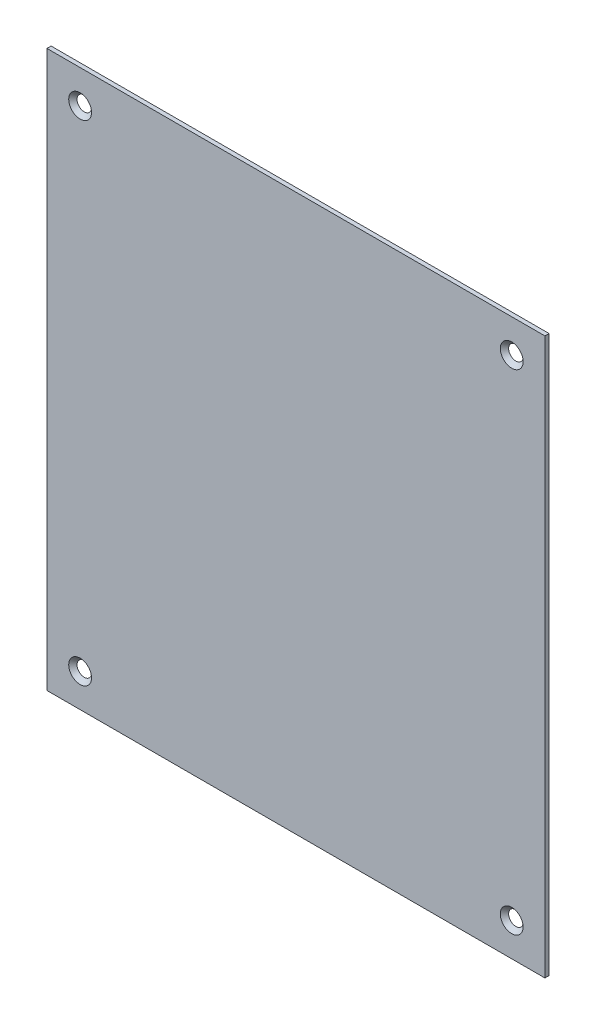
ISO-10303-21;
HEADER;
FILE_DESCRIPTION(('STEP AP214'),'2;1');
FILE_NAME('part.step','',(''),(''),'','','');
FILE_SCHEMA(('AUTOMOTIVE_DESIGN { 1 0 10303 214 1 1 1 1 }'));
ENDSEC;
DATA;
#1=APPLICATION_CONTEXT('core data for automotive mechanical design processes');
#2=APPLICATION_PROTOCOL_DEFINITION('international standard','automotive_design',2000,#1);
#3=PRODUCT_CONTEXT('',#1,'mechanical');
#4=PRODUCT('Part','Part','',(#3));
#5=PRODUCT_RELATED_PRODUCT_CATEGORY('part','',(#4));
#6=PRODUCT_DEFINITION_FORMATION('','',#4);
#7=PRODUCT_DEFINITION_CONTEXT('part definition',#1,'design');
#8=PRODUCT_DEFINITION('design','',#6,#7);
#9=PRODUCT_DEFINITION_SHAPE('','',#8);
#10=(LENGTH_UNIT() NAMED_UNIT(*) SI_UNIT(.MILLI.,.METRE.));
#11=(NAMED_UNIT(*) PLANE_ANGLE_UNIT() SI_UNIT($,.RADIAN.));
#12=(NAMED_UNIT(*) SI_UNIT($,.STERADIAN.) SOLID_ANGLE_UNIT());
#13=UNCERTAINTY_MEASURE_WITH_UNIT(LENGTH_MEASURE(1.E-05),#10,'distance_accuracy_value','');
#14=(GEOMETRIC_REPRESENTATION_CONTEXT(3) GLOBAL_UNCERTAINTY_ASSIGNED_CONTEXT((#13)) GLOBAL_UNIT_ASSIGNED_CONTEXT((#10,
#11,#12)) REPRESENTATION_CONTEXT('',''));
#15=CARTESIAN_POINT('',(0.,0.,0.));
#16=DIRECTION('',(0.,0.,1.));
#17=DIRECTION('',(1.,0.,0.));
#18=AXIS2_PLACEMENT_3D('',#15,#16,#17);
#19=CARTESIAN_POINT('',(0.,0.,-1.));
#20=DIRECTION('',(0.,0.,1.));
#21=DIRECTION('',(1.,0.,0.));
#22=AXIS2_PLACEMENT_3D('',#19,#20,#21);
#23=PLANE('',#22);
#24=CARTESIAN_POINT('',(-63.1340206185567,49.9896907216495,-1.));
#25=DIRECTION('',(0.,0.,1.));
#26=DIRECTION('',(1.,0.,0.));
#27=AXIS2_PLACEMENT_3D('',#24,#25,#26);
#28=CIRCLE('',#27,1.75);
#29=CARTESIAN_POINT('',(-61.3840206185567,49.9896907216495,-1.));
#30=VERTEX_POINT('',#29);
#31=EDGE_CURVE('E37',#30,#30,#28,.T.);
#32=ORIENTED_EDGE('',*,*,#31,.T.);
#33=EDGE_LOOP('',(#32));
#34=FACE_BOUND('',#33,.T.);
#35=CARTESIAN_POINT('',(-63.1340206185567,-68.0103092783505,-1.));
#36=DIRECTION('',(0.,0.,1.));
#37=DIRECTION('',(1.,0.,0.));
#38=AXIS2_PLACEMENT_3D('',#35,#36,#37);
#39=CIRCLE('',#38,1.75);
#40=CARTESIAN_POINT('',(-61.3840206185567,-68.0103092783505,-1.));
#41=VERTEX_POINT('',#40);
#42=EDGE_CURVE('E115',#41,#41,#39,.T.);
#43=ORIENTED_EDGE('',*,*,#42,.T.);
#44=EDGE_LOOP('',(#43));
#45=FACE_BOUND('',#44,.T.);
#46=CARTESIAN_POINT('',(40.8659793814433,-68.0103092783505,-1.));
#47=DIRECTION('',(0.,0.,1.));
#48=DIRECTION('',(1.,0.,0.));
#49=AXIS2_PLACEMENT_3D('',#46,#47,#48);
#50=CIRCLE('',#49,1.75);
#51=CARTESIAN_POINT('',(42.6159793814433,-68.0103092783505,-1.));
#52=VERTEX_POINT('',#51);
#53=EDGE_CURVE('E111',#52,#52,#50,.T.);
#54=ORIENTED_EDGE('',*,*,#53,.T.);
#55=EDGE_LOOP('',(#54));
#56=FACE_BOUND('',#55,.T.);
#57=CARTESIAN_POINT('',(40.8659793814433,49.9896907216495,-1.));
#58=DIRECTION('',(0.,0.,1.));
#59=DIRECTION('',(1.,0.,0.));
#60=AXIS2_PLACEMENT_3D('',#57,#58,#59);
#61=CIRCLE('',#60,1.75);
#62=CARTESIAN_POINT('',(42.6159793814433,49.9896907216495,-1.));
#63=VERTEX_POINT('',#62);
#64=EDGE_CURVE('E104',#63,#63,#61,.T.);
#65=ORIENTED_EDGE('',*,*,#64,.T.);
#66=EDGE_LOOP('',(#65));
#67=FACE_BOUND('',#66,.T.);
#68=DIRECTION('',(0.,-1.,0.));
#69=VECTOR('',#68,1.);
#70=CARTESIAN_POINT('',(-71.1340206185567,57.9896907216495,-1.));
#71=LINE('',#70,#69);
#72=CARTESIAN_POINT('',(-71.1340206185567,57.9896907216495,-1.));
#73=VERTEX_POINT('',#72);
#74=CARTESIAN_POINT('',(-71.1340206185566,-76.0103092783505,-1.));
#75=VERTEX_POINT('',#74);
#76=EDGE_CURVE('E93',#73,#75,#71,.T.);
#77=ORIENTED_EDGE('',*,*,#76,.F.);
#78=DIRECTION('',(-1.,0.,0.));
#79=VECTOR('',#78,1.);
#80=CARTESIAN_POINT('',(-71.1340206185567,57.9896907216495,-1.));
#81=LINE('',#80,#79);
#82=CARTESIAN_POINT('',(48.8659793814433,57.9896907216495,-1.));
#83=VERTEX_POINT('',#82);
#84=EDGE_CURVE('E90',#83,#73,#81,.T.);
#85=ORIENTED_EDGE('',*,*,#84,.F.);
#86=DIRECTION('',(0.,1.,0.));
#87=VECTOR('',#86,1.);
#88=CARTESIAN_POINT('',(48.8659793814433,57.9896907216495,-1.));
#89=LINE('',#88,#87);
#90=CARTESIAN_POINT('',(48.8659793814433,-76.0103092783505,-1.));
#91=VERTEX_POINT('',#90);
#92=EDGE_CURVE('E83',#91,#83,#89,.T.);
#93=ORIENTED_EDGE('',*,*,#92,.F.);
#94=DIRECTION('',(1.,0.,0.));
#95=VECTOR('',#94,1.);
#96=CARTESIAN_POINT('',(-71.1340206185566,-76.0103092783505,-1.));
#97=LINE('',#96,#95);
#98=EDGE_CURVE('E89',#75,#91,#97,.T.);
#99=ORIENTED_EDGE('',*,*,#98,.F.);
#100=EDGE_LOOP('',(#77,#85,#93,#99));
#101=FACE_BOUND('',#100,.T.);
#102=ADVANCED_FACE('F33',(#34,#45,#56,#67,#101),#23,.F.);
#103=CARTESIAN_POINT('',(-71.1340206185567,57.9896907216495,-1.));
#104=DIRECTION('',(-1.,0.,0.));
#105=DIRECTION('',(0.,-1.,0.));
#106=AXIS2_PLACEMENT_3D('',#103,#104,#105);
#107=PLANE('',#106);
#108=DIRECTION('',(0.,-1.,0.));
#109=VECTOR('',#108,1.);
#110=CARTESIAN_POINT('',(-71.1340206185567,57.9896907216495,0.));
#111=LINE('',#110,#109);
#112=CARTESIAN_POINT('',(-71.1340206185567,57.9896907216495,0.));
#113=VERTEX_POINT('',#112);
#114=CARTESIAN_POINT('',(-71.1340206185566,-76.0103092783505,0.));
#115=VERTEX_POINT('',#114);
#116=EDGE_CURVE('E100',#113,#115,#111,.T.);
#117=ORIENTED_EDGE('',*,*,#116,.F.);
#118=DIRECTION('',(0.,0.,1.));
#119=VECTOR('',#118,1.);
#120=CARTESIAN_POINT('',(-71.1340206185567,57.9896907216495,-1.));
#121=LINE('',#120,#119);
#122=EDGE_CURVE('E11',#73,#113,#121,.T.);
#123=ORIENTED_EDGE('',*,*,#122,.F.);
#124=ORIENTED_EDGE('',*,*,#76,.T.);
#125=DIRECTION('',(0.,0.,1.));
#126=VECTOR('',#125,1.);
#127=CARTESIAN_POINT('',(-71.1340206185566,-76.0103092783505,-1.));
#128=LINE('',#127,#126);
#129=EDGE_CURVE('E77',#75,#115,#128,.T.);
#130=ORIENTED_EDGE('',*,*,#129,.T.);
#131=EDGE_LOOP('',(#117,#123,#124,#130));
#132=FACE_BOUND('',#131,.T.);
#133=ADVANCED_FACE('F35',(#132),#107,.T.);
#134=CARTESIAN_POINT('',(-71.1340206185567,57.9896907216495,-1.));
#135=DIRECTION('',(0.,1.,0.));
#136=DIRECTION('',(0.,0.,1.));
#137=AXIS2_PLACEMENT_3D('',#134,#135,#136);
#138=PLANE('',#137);
#139=DIRECTION('',(-1.,0.,0.));
#140=VECTOR('',#139,1.);
#141=CARTESIAN_POINT('',(-71.1340206185567,57.9896907216495,0.));
#142=LINE('',#141,#140);
#143=CARTESIAN_POINT('',(48.8659793814433,57.9896907216495,0.));
#144=VERTEX_POINT('',#143);
#145=EDGE_CURVE('E95',#144,#113,#142,.T.);
#146=ORIENTED_EDGE('',*,*,#145,.F.);
#147=DIRECTION('',(0.,0.,1.));
#148=VECTOR('',#147,1.);
#149=CARTESIAN_POINT('',(48.8659793814433,57.9896907216495,-1.));
#150=LINE('',#149,#148);
#151=EDGE_CURVE('E43',#83,#144,#150,.T.);
#152=ORIENTED_EDGE('',*,*,#151,.F.);
#153=ORIENTED_EDGE('',*,*,#84,.T.);
#154=ORIENTED_EDGE('',*,*,#122,.T.);
#155=EDGE_LOOP('',(#146,#152,#153,#154));
#156=FACE_BOUND('',#155,.T.);
#157=ADVANCED_FACE('F156',(#156),#138,.T.);
#158=CARTESIAN_POINT('',(48.8659793814433,57.9896907216495,-1.));
#159=DIRECTION('',(1.,0.,0.));
#160=DIRECTION('',(0.,1.,0.));
#161=AXIS2_PLACEMENT_3D('',#158,#159,#160);
#162=PLANE('',#161);
#163=DIRECTION('',(0.,1.,0.));
#164=VECTOR('',#163,1.);
#165=CARTESIAN_POINT('',(48.8659793814433,57.9896907216495,0.));
#166=LINE('',#165,#164);
#167=CARTESIAN_POINT('',(48.8659793814433,-76.0103092783505,0.));
#168=VERTEX_POINT('',#167);
#169=EDGE_CURVE('E85',#168,#144,#166,.T.);
#170=ORIENTED_EDGE('',*,*,#169,.F.);
#171=DIRECTION('',(0.,0.,1.));
#172=VECTOR('',#171,1.);
#173=CARTESIAN_POINT('',(48.8659793814433,-76.0103092783505,-1.));
#174=LINE('',#173,#172);
#175=EDGE_CURVE('E80',#91,#168,#174,.T.);
#176=ORIENTED_EDGE('',*,*,#175,.F.);
#177=ORIENTED_EDGE('',*,*,#92,.T.);
#178=ORIENTED_EDGE('',*,*,#151,.T.);
#179=EDGE_LOOP('',(#170,#176,#177,#178));
#180=FACE_BOUND('',#179,.T.);
#181=ADVANCED_FACE('F82',(#180),#162,.T.);
#182=CARTESIAN_POINT('',(-71.1340206185566,-76.0103092783505,-1.));
#183=DIRECTION('',(0.,-1.,0.));
#184=DIRECTION('',(0.,0.,-1.));
#185=AXIS2_PLACEMENT_3D('',#182,#183,#184);
#186=PLANE('',#185);
#187=DIRECTION('',(1.,0.,0.));
#188=VECTOR('',#187,1.);
#189=CARTESIAN_POINT('',(-71.1340206185566,-76.0103092783505,0.));
#190=LINE('',#189,#188);
#191=EDGE_CURVE('E103',#115,#168,#190,.T.);
#192=ORIENTED_EDGE('',*,*,#191,.F.);
#193=ORIENTED_EDGE('',*,*,#129,.F.);
#194=ORIENTED_EDGE('',*,*,#98,.T.);
#195=ORIENTED_EDGE('',*,*,#175,.T.);
#196=EDGE_LOOP('',(#192,#193,#194,#195));
#197=FACE_BOUND('',#196,.T.);
#198=ADVANCED_FACE('F92',(#197),#186,.T.);
#199=CARTESIAN_POINT('',(0.,0.,0.));
#200=DIRECTION('',(0.,0.,1.));
#201=DIRECTION('',(1.,0.,0.));
#202=AXIS2_PLACEMENT_3D('',#199,#200,#201);
#203=PLANE('',#202);
#204=CARTESIAN_POINT('',(-63.1340206185567,49.9896907216495,0.));
#205=DIRECTION('',(0.,0.,1.));
#206=DIRECTION('',(1.,0.,0.));
#207=AXIS2_PLACEMENT_3D('',#204,#205,#206);
#208=CIRCLE('',#207,2.75);
#209=CARTESIAN_POINT('',(-60.3840206185567,49.9896907216495,0.));
#210=VERTEX_POINT('',#209);
#211=EDGE_CURVE('E127',#210,#210,#208,.T.);
#212=ORIENTED_EDGE('',*,*,#211,.F.);
#213=EDGE_LOOP('',(#212));
#214=FACE_BOUND('',#213,.T.);
#215=CARTESIAN_POINT('',(-63.1340206185567,-68.0103092783505,0.));
#216=DIRECTION('',(0.,0.,1.));
#217=DIRECTION('',(1.,0.,0.));
#218=AXIS2_PLACEMENT_3D('',#215,#216,#217);
#219=CIRCLE('',#218,2.75);
#220=CARTESIAN_POINT('',(-60.3840206185567,-68.0103092783505,0.));
#221=VERTEX_POINT('',#220);
#222=EDGE_CURVE('E117',#221,#221,#219,.T.);
#223=ORIENTED_EDGE('',*,*,#222,.F.);
#224=EDGE_LOOP('',(#223));
#225=FACE_BOUND('',#224,.T.);
#226=CARTESIAN_POINT('',(40.8659793814433,-68.0103092783505,0.));
#227=DIRECTION('',(0.,0.,1.));
#228=DIRECTION('',(1.,0.,0.));
#229=AXIS2_PLACEMENT_3D('',#226,#227,#228);
#230=CIRCLE('',#229,2.75);
#231=CARTESIAN_POINT('',(43.6159793814433,-68.0103092783505,0.));
#232=VERTEX_POINT('',#231);
#233=EDGE_CURVE('E114',#232,#232,#230,.T.);
#234=ORIENTED_EDGE('',*,*,#233,.F.);
#235=EDGE_LOOP('',(#234));
#236=FACE_BOUND('',#235,.T.);
#237=CARTESIAN_POINT('',(40.8659793814433,49.9896907216495,0.));
#238=DIRECTION('',(0.,0.,1.));
#239=DIRECTION('',(1.,0.,0.));
#240=AXIS2_PLACEMENT_3D('',#237,#238,#239);
#241=CIRCLE('',#240,2.75);
#242=CARTESIAN_POINT('',(43.6159793814433,49.9896907216495,0.));
#243=VERTEX_POINT('',#242);
#244=EDGE_CURVE('E113',#243,#243,#241,.T.);
#245=ORIENTED_EDGE('',*,*,#244,.F.);
#246=EDGE_LOOP('',(#245));
#247=FACE_BOUND('',#246,.T.);
#248=ORIENTED_EDGE('',*,*,#116,.T.);
#249=ORIENTED_EDGE('',*,*,#191,.T.);
#250=ORIENTED_EDGE('',*,*,#169,.T.);
#251=ORIENTED_EDGE('',*,*,#145,.T.);
#252=EDGE_LOOP('',(#248,#249,#250,#251));
#253=FACE_BOUND('',#252,.T.);
#254=ADVANCED_FACE('F138',(#214,#225,#236,#247,#253),#203,.T.);
#255=CARTESIAN_POINT('',(40.8659793814433,49.9896907216495,0.));
#256=DIRECTION('',(0.,0.,1.));
#257=DIRECTION('',(1.,0.,0.));
#258=AXIS2_PLACEMENT_3D('',#255,#256,#257);
#259=CONICAL_SURFACE('',#258,2.75,0.785398163397448);
#260=ORIENTED_EDGE('',*,*,#244,.T.);
#261=EDGE_LOOP('',(#260));
#262=FACE_BOUND('',#261,.T.);
#263=ORIENTED_EDGE('',*,*,#64,.F.);
#264=EDGE_LOOP('',(#263));
#265=FACE_BOUND('',#264,.T.);
#266=ADVANCED_FACE('F135',(#262,#265),#259,.F.);
#267=CARTESIAN_POINT('',(40.8659793814433,-68.0103092783505,0.));
#268=DIRECTION('',(0.,0.,1.));
#269=DIRECTION('',(1.,0.,0.));
#270=AXIS2_PLACEMENT_3D('',#267,#268,#269);
#271=CONICAL_SURFACE('',#270,2.75,0.785398163397448);
#272=ORIENTED_EDGE('',*,*,#233,.T.);
#273=EDGE_LOOP('',(#272));
#274=FACE_BOUND('',#273,.T.);
#275=ORIENTED_EDGE('',*,*,#53,.F.);
#276=EDGE_LOOP('',(#275));
#277=FACE_BOUND('',#276,.T.);
#278=ADVANCED_FACE('F137',(#274,#277),#271,.F.);
#279=CARTESIAN_POINT('',(-63.1340206185567,-68.0103092783505,0.));
#280=DIRECTION('',(0.,0.,1.));
#281=DIRECTION('',(1.,0.,0.));
#282=AXIS2_PLACEMENT_3D('',#279,#280,#281);
#283=CONICAL_SURFACE('',#282,2.75,0.785398163397448);
#284=ORIENTED_EDGE('',*,*,#222,.T.);
#285=EDGE_LOOP('',(#284));
#286=FACE_BOUND('',#285,.T.);
#287=ORIENTED_EDGE('',*,*,#42,.F.);
#288=EDGE_LOOP('',(#287));
#289=FACE_BOUND('',#288,.T.);
#290=ADVANCED_FACE('F145',(#286,#289),#283,.F.);
#291=CARTESIAN_POINT('',(-63.1340206185567,49.9896907216495,0.));
#292=DIRECTION('',(0.,0.,1.));
#293=DIRECTION('',(1.,0.,0.));
#294=AXIS2_PLACEMENT_3D('',#291,#292,#293);
#295=CONICAL_SURFACE('',#294,2.75,0.785398163397448);
#296=ORIENTED_EDGE('',*,*,#211,.T.);
#297=EDGE_LOOP('',(#296));
#298=FACE_BOUND('',#297,.T.);
#299=ORIENTED_EDGE('',*,*,#31,.F.);
#300=EDGE_LOOP('',(#299));
#301=FACE_BOUND('',#300,.T.);
#302=ADVANCED_FACE('F191',(#298,#301),#295,.F.);
#303=CLOSED_SHELL('',(#102,#133,#157,#181,#198,#254,#266,#278,#290,#302));
#304=MANIFOLD_SOLID_BREP('B2',#303);
#305=ADVANCED_BREP_SHAPE_REPRESENTATION('',(#18,#304),#14);
#306=SHAPE_DEFINITION_REPRESENTATION(#9,#305);
ENDSEC;
END-ISO-10303-21;
